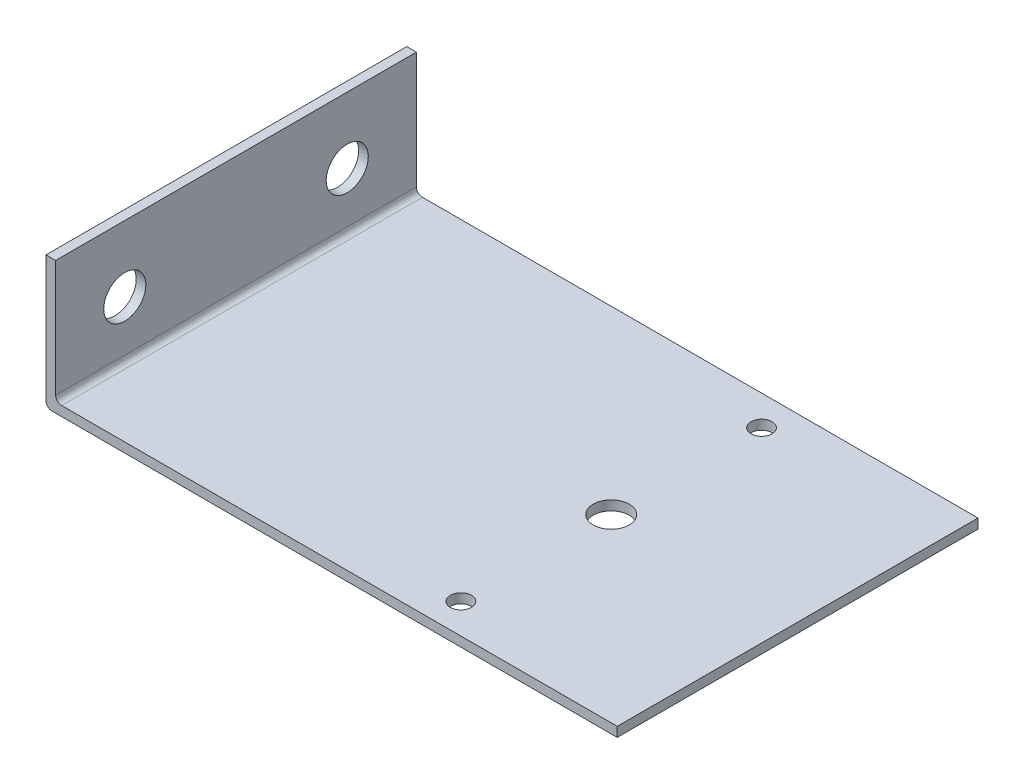
ISO-10303-21;
HEADER;
FILE_DESCRIPTION(('STEP AP214'),'2;1');
FILE_NAME('part.step','',(''),(''),'','','');
FILE_SCHEMA(('AUTOMOTIVE_DESIGN { 1 0 10303 214 1 1 1 1 }'));
ENDSEC;
DATA;
#1=APPLICATION_CONTEXT('core data for automotive mechanical design processes');
#2=APPLICATION_PROTOCOL_DEFINITION('international standard','automotive_design',2000,#1);
#3=PRODUCT_CONTEXT('',#1,'mechanical');
#4=PRODUCT('Part','Part','',(#3));
#5=PRODUCT_RELATED_PRODUCT_CATEGORY('part','',(#4));
#6=PRODUCT_DEFINITION_FORMATION('','',#4);
#7=PRODUCT_DEFINITION_CONTEXT('part definition',#1,'design');
#8=PRODUCT_DEFINITION('design','',#6,#7);
#9=PRODUCT_DEFINITION_SHAPE('','',#8);
#10=(LENGTH_UNIT() NAMED_UNIT(*) SI_UNIT(.MILLI.,.METRE.));
#11=(NAMED_UNIT(*) PLANE_ANGLE_UNIT() SI_UNIT($,.RADIAN.));
#12=(NAMED_UNIT(*) SI_UNIT($,.STERADIAN.) SOLID_ANGLE_UNIT());
#13=UNCERTAINTY_MEASURE_WITH_UNIT(LENGTH_MEASURE(1.E-05),#10,'distance_accuracy_value','');
#14=(GEOMETRIC_REPRESENTATION_CONTEXT(3) GLOBAL_UNCERTAINTY_ASSIGNED_CONTEXT((#13)) GLOBAL_UNIT_ASSIGNED_CONTEXT((#10,
#11,#12)) REPRESENTATION_CONTEXT('',''));
#15=CARTESIAN_POINT('',(0.,0.,0.));
#16=DIRECTION('',(0.,0.,1.));
#17=DIRECTION('',(1.,0.,0.));
#18=AXIS2_PLACEMENT_3D('',#15,#16,#17);
#19=CARTESIAN_POINT('',(-93.4,22.,60.));
#20=DIRECTION('',(0.,-1.,0.));
#21=DIRECTION('',(1.,0.,0.));
#22=AXIS2_PLACEMENT_3D('',#19,#20,#21);
#23=PLANE('',#22);
#24=DIRECTION('',(-1.,0.,0.));
#25=VECTOR('',#24,1.);
#26=CARTESIAN_POINT('',(-93.4,22.,0.));
#27=LINE('',#26,#25);
#28=CARTESIAN_POINT('',(-93.4,22.,0.));
#29=VERTEX_POINT('',#28);
#30=CARTESIAN_POINT('',(-95.,22.,0.));
#31=VERTEX_POINT('',#30);
#32=EDGE_CURVE('E124',#29,#31,#27,.T.);
#33=ORIENTED_EDGE('',*,*,#32,.T.);
#34=DIRECTION('',(0.,0.,-1.));
#35=VECTOR('',#34,1.);
#36=CARTESIAN_POINT('',(-95.,22.,60.));
#37=LINE('',#36,#35);
#38=CARTESIAN_POINT('',(-95.,22.,60.));
#39=VERTEX_POINT('',#38);
#40=EDGE_CURVE('E105',#39,#31,#37,.T.);
#41=ORIENTED_EDGE('',*,*,#40,.F.);
#42=DIRECTION('',(-1.,0.,0.));
#43=VECTOR('',#42,1.);
#44=CARTESIAN_POINT('',(-93.4,22.,60.));
#45=LINE('',#44,#43);
#46=CARTESIAN_POINT('',(-93.4,22.,60.));
#47=VERTEX_POINT('',#46);
#48=EDGE_CURVE('E112',#47,#39,#45,.T.);
#49=ORIENTED_EDGE('',*,*,#48,.F.);
#50=DIRECTION('',(0.,0.,-1.));
#51=VECTOR('',#50,1.);
#52=CARTESIAN_POINT('',(-93.4,22.,60.));
#53=LINE('',#52,#51);
#54=EDGE_CURVE('E181',#47,#29,#53,.T.);
#55=ORIENTED_EDGE('',*,*,#54,.T.);
#56=EDGE_LOOP('',(#33,#41,#49,#55));
#57=FACE_BOUND('',#56,.T.);
#58=ADVANCED_FACE('F33',(#57),#23,.F.);
#59=CARTESIAN_POINT('',(-95.,22.,60.));
#60=DIRECTION('',(1.,0.,0.));
#61=DIRECTION('',(0.,0.,-1.));
#62=AXIS2_PLACEMENT_3D('',#59,#60,#61);
#63=PLANE('',#62);
#64=CARTESIAN_POINT('',(-95.,11.,48.5));
#65=DIRECTION('',(-1.,0.,0.));
#66=DIRECTION('',(0.,0.,1.));
#67=AXIS2_PLACEMENT_3D('',#64,#65,#66);
#68=CIRCLE('',#67,3.5);
#69=CARTESIAN_POINT('',(-95.,11.,52.));
#70=VERTEX_POINT('',#69);
#71=EDGE_CURVE('E158',#70,#70,#68,.T.);
#72=ORIENTED_EDGE('',*,*,#71,.F.);
#73=EDGE_LOOP('',(#72));
#74=FACE_BOUND('',#73,.T.);
#75=CARTESIAN_POINT('',(-95.,11.,11.5));
#76=DIRECTION('',(-1.,0.,0.));
#77=DIRECTION('',(0.,0.,1.));
#78=AXIS2_PLACEMENT_3D('',#75,#76,#77);
#79=CIRCLE('',#78,3.5);
#80=CARTESIAN_POINT('',(-95.,11.,15.));
#81=VERTEX_POINT('',#80);
#82=EDGE_CURVE('E147',#81,#81,#79,.T.);
#83=ORIENTED_EDGE('',*,*,#82,.F.);
#84=EDGE_LOOP('',(#83));
#85=FACE_BOUND('',#84,.T.);
#86=DIRECTION('',(0.,-1.,0.));
#87=VECTOR('',#86,1.);
#88=CARTESIAN_POINT('',(-95.,22.,0.));
#89=LINE('',#88,#87);
#90=CARTESIAN_POINT('',(-95.,1.,0.));
#91=VERTEX_POINT('',#90);
#92=EDGE_CURVE('E183',#31,#91,#89,.T.);
#93=ORIENTED_EDGE('',*,*,#92,.T.);
#94=DIRECTION('',(0.,0.,-1.));
#95=VECTOR('',#94,1.);
#96=CARTESIAN_POINT('',(-95.,1.,60.));
#97=LINE('',#96,#95);
#98=CARTESIAN_POINT('',(-95.,1.,60.));
#99=VERTEX_POINT('',#98);
#100=EDGE_CURVE('E108',#91,#99,#97,.F.);
#101=ORIENTED_EDGE('',*,*,#100,.T.);
#102=DIRECTION('',(0.,-1.,0.));
#103=VECTOR('',#102,1.);
#104=CARTESIAN_POINT('',(-95.,22.,60.));
#105=LINE('',#104,#103);
#106=EDGE_CURVE('E100',#39,#99,#105,.T.);
#107=ORIENTED_EDGE('',*,*,#106,.F.);
#108=ORIENTED_EDGE('',*,*,#40,.T.);
#109=EDGE_LOOP('',(#93,#101,#107,#108));
#110=FACE_BOUND('',#109,.T.);
#111=ADVANCED_FACE('F103',(#74,#85,#110),#63,.F.);
#112=CARTESIAN_POINT('',(-95.,0.,60.));
#113=DIRECTION('',(0.,1.,0.));
#114=DIRECTION('',(0.,0.,1.));
#115=AXIS2_PLACEMENT_3D('',#112,#113,#114);
#116=PLANE('',#115);
#117=CARTESIAN_POINT('',(-31.,0.,55.));
#118=DIRECTION('',(0.,1.,0.));
#119=DIRECTION('',(0.,0.,1.));
#120=AXIS2_PLACEMENT_3D('',#117,#118,#119);
#121=CIRCLE('',#120,1.75);
#122=CARTESIAN_POINT('',(-31.,0.,56.75));
#123=VERTEX_POINT('',#122);
#124=EDGE_CURVE('E151',#123,#123,#121,.F.);
#125=ORIENTED_EDGE('',*,*,#124,.F.);
#126=EDGE_LOOP('',(#125));
#127=FACE_BOUND('',#126,.T.);
#128=CARTESIAN_POINT('',(-31.,0.,30.));
#129=DIRECTION('',(0.,1.,0.));
#130=DIRECTION('',(0.,0.,1.));
#131=AXIS2_PLACEMENT_3D('',#128,#129,#130);
#132=CIRCLE('',#131,3.);
#133=CARTESIAN_POINT('',(-31.,0.,33.));
#134=VERTEX_POINT('',#133);
#135=EDGE_CURVE('E166',#134,#134,#132,.F.);
#136=ORIENTED_EDGE('',*,*,#135,.F.);
#137=EDGE_LOOP('',(#136));
#138=FACE_BOUND('',#137,.T.);
#139=CARTESIAN_POINT('',(-31.,0.,5.));
#140=DIRECTION('',(0.,1.,0.));
#141=DIRECTION('',(0.,0.,1.));
#142=AXIS2_PLACEMENT_3D('',#139,#140,#141);
#143=CIRCLE('',#142,1.75);
#144=CARTESIAN_POINT('',(-31.,0.,6.75));
#145=VERTEX_POINT('',#144);
#146=EDGE_CURVE('E172',#145,#145,#143,.F.);
#147=ORIENTED_EDGE('',*,*,#146,.F.);
#148=EDGE_LOOP('',(#147));
#149=FACE_BOUND('',#148,.T.);
#150=DIRECTION('',(1.,0.,0.));
#151=VECTOR('',#150,1.);
#152=CARTESIAN_POINT('',(-95.,0.,60.));
#153=LINE('',#152,#151);
#154=CARTESIAN_POINT('',(-94.,0.,60.));
#155=VERTEX_POINT('',#154);
#156=CARTESIAN_POINT('',(0.,0.,60.));
#157=VERTEX_POINT('',#156);
#158=EDGE_CURVE('E111',#155,#157,#153,.T.);
#159=ORIENTED_EDGE('',*,*,#158,.F.);
#160=DIRECTION('',(0.,0.,-1.));
#161=VECTOR('',#160,1.);
#162=CARTESIAN_POINT('',(-94.,0.,60.));
#163=LINE('',#162,#161);
#164=CARTESIAN_POINT('',(-94.,0.,0.));
#165=VERTEX_POINT('',#164);
#166=EDGE_CURVE('E125',#155,#165,#163,.T.);
#167=ORIENTED_EDGE('',*,*,#166,.T.);
#168=DIRECTION('',(1.,0.,0.));
#169=VECTOR('',#168,1.);
#170=CARTESIAN_POINT('',(-95.,0.,0.));
#171=LINE('',#170,#169);
#172=CARTESIAN_POINT('',(0.,0.,0.));
#173=VERTEX_POINT('',#172);
#174=EDGE_CURVE('E185',#165,#173,#171,.T.);
#175=ORIENTED_EDGE('',*,*,#174,.T.);
#176=DIRECTION('',(0.,0.,-1.));
#177=VECTOR('',#176,1.);
#178=CARTESIAN_POINT('',(0.,0.,60.));
#179=LINE('',#178,#177);
#180=EDGE_CURVE('E126',#157,#173,#179,.T.);
#181=ORIENTED_EDGE('',*,*,#180,.F.);
#182=EDGE_LOOP('',(#159,#167,#175,#181));
#183=FACE_BOUND('',#182,.T.);
#184=ADVANCED_FACE('F204',(#127,#138,#149,#183),#116,.F.);
#185=CARTESIAN_POINT('',(0.,0.,60.));
#186=DIRECTION('',(-1.,0.,0.));
#187=DIRECTION('',(0.,0.,1.));
#188=AXIS2_PLACEMENT_3D('',#185,#186,#187);
#189=PLANE('',#188);
#190=DIRECTION('',(0.,1.,0.));
#191=VECTOR('',#190,1.);
#192=CARTESIAN_POINT('',(0.,0.,0.));
#193=LINE('',#192,#191);
#194=CARTESIAN_POINT('',(0.,1.6,0.));
#195=VERTEX_POINT('',#194);
#196=EDGE_CURVE('E187',#173,#195,#193,.T.);
#197=ORIENTED_EDGE('',*,*,#196,.T.);
#198=DIRECTION('',(0.,0.,-1.));
#199=VECTOR('',#198,1.);
#200=CARTESIAN_POINT('',(0.,1.6,60.));
#201=LINE('',#200,#199);
#202=CARTESIAN_POINT('',(0.,1.6,60.));
#203=VERTEX_POINT('',#202);
#204=EDGE_CURVE('E132',#203,#195,#201,.T.);
#205=ORIENTED_EDGE('',*,*,#204,.F.);
#206=DIRECTION('',(0.,1.,0.));
#207=VECTOR('',#206,1.);
#208=CARTESIAN_POINT('',(0.,0.,60.));
#209=LINE('',#208,#207);
#210=EDGE_CURVE('E176',#157,#203,#209,.T.);
#211=ORIENTED_EDGE('',*,*,#210,.F.);
#212=ORIENTED_EDGE('',*,*,#180,.T.);
#213=EDGE_LOOP('',(#197,#205,#211,#212));
#214=FACE_BOUND('',#213,.T.);
#215=ADVANCED_FACE('F200',(#214),#189,.F.);
#216=CARTESIAN_POINT('',(0.,1.6,60.));
#217=DIRECTION('',(0.,-1.,0.));
#218=DIRECTION('',(1.,0.,0.));
#219=AXIS2_PLACEMENT_3D('',#216,#217,#218);
#220=PLANE('',#219);
#221=CARTESIAN_POINT('',(-31.,1.6,55.));
#222=DIRECTION('',(0.,1.,0.));
#223=DIRECTION('',(-1.,0.,0.));
#224=AXIS2_PLACEMENT_3D('',#221,#222,#223);
#225=CIRCLE('',#224,1.75);
#226=CARTESIAN_POINT('',(-32.75,1.6,55.));
#227=VERTEX_POINT('',#226);
#228=EDGE_CURVE('E146',#227,#227,#225,.T.);
#229=ORIENTED_EDGE('',*,*,#228,.F.);
#230=EDGE_LOOP('',(#229));
#231=FACE_BOUND('',#230,.T.);
#232=CARTESIAN_POINT('',(-31.,1.6,30.));
#233=DIRECTION('',(0.,1.,0.));
#234=DIRECTION('',(-1.,0.,0.));
#235=AXIS2_PLACEMENT_3D('',#232,#233,#234);
#236=CIRCLE('',#235,3.);
#237=CARTESIAN_POINT('',(-34.,1.6,30.));
#238=VERTEX_POINT('',#237);
#239=EDGE_CURVE('E163',#238,#238,#236,.T.);
#240=ORIENTED_EDGE('',*,*,#239,.F.);
#241=EDGE_LOOP('',(#240));
#242=FACE_BOUND('',#241,.T.);
#243=CARTESIAN_POINT('',(-31.,1.6,5.));
#244=DIRECTION('',(0.,1.,0.));
#245=DIRECTION('',(-1.,0.,0.));
#246=AXIS2_PLACEMENT_3D('',#243,#244,#245);
#247=CIRCLE('',#246,1.75);
#248=CARTESIAN_POINT('',(-32.75,1.6,5.));
#249=VERTEX_POINT('',#248);
#250=EDGE_CURVE('E169',#249,#249,#247,.T.);
#251=ORIENTED_EDGE('',*,*,#250,.F.);
#252=EDGE_LOOP('',(#251));
#253=FACE_BOUND('',#252,.T.);
#254=DIRECTION('',(-1.,0.,0.));
#255=VECTOR('',#254,1.);
#256=CARTESIAN_POINT('',(0.,1.6,0.));
#257=LINE('',#256,#255);
#258=CARTESIAN_POINT('',(-92.4,1.59999999999999,0.));
#259=VERTEX_POINT('',#258);
#260=EDGE_CURVE('E189',#195,#259,#257,.T.);
#261=ORIENTED_EDGE('',*,*,#260,.T.);
#262=DIRECTION('',(0.,0.,-1.));
#263=VECTOR('',#262,1.);
#264=CARTESIAN_POINT('',(-92.4,1.59999999999999,60.));
#265=LINE('',#264,#263);
#266=CARTESIAN_POINT('',(-92.4,1.59999999999999,60.));
#267=VERTEX_POINT('',#266);
#268=EDGE_CURVE('E50',#259,#267,#265,.F.);
#269=ORIENTED_EDGE('',*,*,#268,.T.);
#270=DIRECTION('',(-1.,0.,0.));
#271=VECTOR('',#270,1.);
#272=CARTESIAN_POINT('',(0.,1.6,60.));
#273=LINE('',#272,#271);
#274=EDGE_CURVE('E178',#203,#267,#273,.T.);
#275=ORIENTED_EDGE('',*,*,#274,.F.);
#276=ORIENTED_EDGE('',*,*,#204,.T.);
#277=EDGE_LOOP('',(#261,#269,#275,#276));
#278=FACE_BOUND('',#277,.T.);
#279=ADVANCED_FACE('F194',(#231,#242,#253,#278),#220,.F.);
#280=CARTESIAN_POINT('',(-93.4,1.59999999999999,60.));
#281=DIRECTION('',(-1.,0.,0.));
#282=DIRECTION('',(0.,-1.,0.));
#283=AXIS2_PLACEMENT_3D('',#280,#281,#282);
#284=PLANE('',#283);
#285=CARTESIAN_POINT('',(-93.4,11.,48.5));
#286=DIRECTION('',(-1.,0.,0.));
#287=DIRECTION('',(0.,-1.,0.));
#288=AXIS2_PLACEMENT_3D('',#285,#286,#287);
#289=CIRCLE('',#288,3.5);
#290=CARTESIAN_POINT('',(-93.4,7.5,48.5));
#291=VERTEX_POINT('',#290);
#292=EDGE_CURVE('E37',#291,#291,#289,.T.);
#293=ORIENTED_EDGE('',*,*,#292,.T.);
#294=EDGE_LOOP('',(#293));
#295=FACE_BOUND('',#294,.T.);
#296=CARTESIAN_POINT('',(-93.4,11.,11.5));
#297=DIRECTION('',(-1.,0.,0.));
#298=DIRECTION('',(0.,-1.,0.));
#299=AXIS2_PLACEMENT_3D('',#296,#297,#298);
#300=CIRCLE('',#299,3.5);
#301=CARTESIAN_POINT('',(-93.4,7.5,11.5));
#302=VERTEX_POINT('',#301);
#303=EDGE_CURVE('E144',#302,#302,#300,.T.);
#304=ORIENTED_EDGE('',*,*,#303,.T.);
#305=EDGE_LOOP('',(#304));
#306=FACE_BOUND('',#305,.T.);
#307=DIRECTION('',(0.,1.,0.));
#308=VECTOR('',#307,1.);
#309=CARTESIAN_POINT('',(-93.4,1.59999999999999,60.));
#310=LINE('',#309,#308);
#311=CARTESIAN_POINT('',(-93.4,2.59999999999999,60.));
#312=VERTEX_POINT('',#311);
#313=EDGE_CURVE('E117',#312,#47,#310,.T.);
#314=ORIENTED_EDGE('',*,*,#313,.F.);
#315=DIRECTION('',(0.,0.,-1.));
#316=VECTOR('',#315,1.);
#317=CARTESIAN_POINT('',(-93.4,2.59999999999999,0.));
#318=LINE('',#317,#316);
#319=CARTESIAN_POINT('',(-93.4,2.59999999999999,0.));
#320=VERTEX_POINT('',#319);
#321=EDGE_CURVE('E140',#312,#320,#318,.T.);
#322=ORIENTED_EDGE('',*,*,#321,.T.);
#323=DIRECTION('',(0.,1.,0.));
#324=VECTOR('',#323,1.);
#325=CARTESIAN_POINT('',(-93.4,1.59999999999999,0.));
#326=LINE('',#325,#324);
#327=EDGE_CURVE('E121',#320,#29,#326,.T.);
#328=ORIENTED_EDGE('',*,*,#327,.T.);
#329=ORIENTED_EDGE('',*,*,#54,.F.);
#330=EDGE_LOOP('',(#314,#322,#328,#329));
#331=FACE_BOUND('',#330,.T.);
#332=ADVANCED_FACE('F209',(#295,#306,#331),#284,.F.);
#333=CARTESIAN_POINT('',(0.,0.,60.));
#334=DIRECTION('',(0.,0.,1.));
#335=DIRECTION('',(1.,0.,0.));
#336=AXIS2_PLACEMENT_3D('',#333,#334,#335);
#337=PLANE('',#336);
#338=ORIENTED_EDGE('',*,*,#106,.T.);
#339=CARTESIAN_POINT('',(-94.,1.,60.));
#340=DIRECTION('',(0.,0.,1.));
#341=DIRECTION('',(1.,0.,0.));
#342=AXIS2_PLACEMENT_3D('',#339,#340,#341);
#343=CIRCLE('',#342,1.);
#344=EDGE_CURVE('E138',#99,#155,#343,.T.);
#345=ORIENTED_EDGE('',*,*,#344,.T.);
#346=ORIENTED_EDGE('',*,*,#158,.T.);
#347=ORIENTED_EDGE('',*,*,#210,.T.);
#348=ORIENTED_EDGE('',*,*,#274,.T.);
#349=CARTESIAN_POINT('',(-92.4,2.59999999999999,60.));
#350=DIRECTION('',(0.,0.,1.));
#351=DIRECTION('',(1.,0.,0.));
#352=AXIS2_PLACEMENT_3D('',#349,#350,#351);
#353=CIRCLE('',#352,1.);
#354=EDGE_CURVE('E11',#267,#312,#353,.F.);
#355=ORIENTED_EDGE('',*,*,#354,.T.);
#356=ORIENTED_EDGE('',*,*,#313,.T.);
#357=ORIENTED_EDGE('',*,*,#48,.T.);
#358=EDGE_LOOP('',(#338,#345,#346,#347,#348,#355,#356,#357));
#359=FACE_BOUND('',#358,.T.);
#360=ADVANCED_FACE('F115',(#359),#337,.T.);
#361=CARTESIAN_POINT('',(0.,0.,0.));
#362=DIRECTION('',(0.,0.,1.));
#363=DIRECTION('',(1.,0.,0.));
#364=AXIS2_PLACEMENT_3D('',#361,#362,#363);
#365=PLANE('',#364);
#366=ORIENTED_EDGE('',*,*,#174,.F.);
#367=CARTESIAN_POINT('',(-94.,1.,0.));
#368=DIRECTION('',(0.,0.,1.));
#369=DIRECTION('',(1.,0.,0.));
#370=AXIS2_PLACEMENT_3D('',#367,#368,#369);
#371=CIRCLE('',#370,1.);
#372=EDGE_CURVE('E129',#165,#91,#371,.F.);
#373=ORIENTED_EDGE('',*,*,#372,.T.);
#374=ORIENTED_EDGE('',*,*,#92,.F.);
#375=ORIENTED_EDGE('',*,*,#32,.F.);
#376=ORIENTED_EDGE('',*,*,#327,.F.);
#377=CARTESIAN_POINT('',(-92.4,2.59999999999999,0.));
#378=DIRECTION('',(0.,0.,1.));
#379=DIRECTION('',(1.,0.,0.));
#380=AXIS2_PLACEMENT_3D('',#377,#378,#379);
#381=CIRCLE('',#380,1.);
#382=EDGE_CURVE('E42',#320,#259,#381,.T.);
#383=ORIENTED_EDGE('',*,*,#382,.T.);
#384=ORIENTED_EDGE('',*,*,#260,.F.);
#385=ORIENTED_EDGE('',*,*,#196,.F.);
#386=EDGE_LOOP('',(#366,#373,#374,#375,#376,#383,#384,#385));
#387=FACE_BOUND('',#386,.T.);
#388=ADVANCED_FACE('F199',(#387),#365,.F.);
#389=CARTESIAN_POINT('',(-94.,1.,60.));
#390=DIRECTION('',(0.,0.,-1.));
#391=DIRECTION('',(-1.,0.,0.));
#392=AXIS2_PLACEMENT_3D('',#389,#390,#391);
#393=CYLINDRICAL_SURFACE('',#392,1.);
#394=ORIENTED_EDGE('',*,*,#344,.F.);
#395=ORIENTED_EDGE('',*,*,#100,.F.);
#396=ORIENTED_EDGE('',*,*,#372,.F.);
#397=ORIENTED_EDGE('',*,*,#166,.F.);
#398=EDGE_LOOP('',(#394,#395,#396,#397));
#399=FACE_BOUND('',#398,.T.);
#400=ADVANCED_FACE('F207',(#399),#393,.T.);
#401=CARTESIAN_POINT('',(-92.4,2.59999999999999,60.));
#402=DIRECTION('',(0.,0.,1.));
#403=DIRECTION('',(1.,0.,0.));
#404=AXIS2_PLACEMENT_3D('',#401,#402,#403);
#405=CYLINDRICAL_SURFACE('',#404,1.);
#406=ORIENTED_EDGE('',*,*,#354,.F.);
#407=ORIENTED_EDGE('',*,*,#268,.F.);
#408=ORIENTED_EDGE('',*,*,#382,.F.);
#409=ORIENTED_EDGE('',*,*,#321,.F.);
#410=EDGE_LOOP('',(#406,#407,#408,#409));
#411=FACE_BOUND('',#410,.T.);
#412=ADVANCED_FACE('F35',(#411),#405,.F.);
#413=CARTESIAN_POINT('',(-31.,-0.0010000000000036,5.));
#414=DIRECTION('',(0.,1.,0.));
#415=DIRECTION('',(-1.,0.,0.));
#416=AXIS2_PLACEMENT_3D('',#413,#414,#415);
#417=CYLINDRICAL_SURFACE('',#416,1.75);
#418=ORIENTED_EDGE('',*,*,#250,.T.);
#419=EDGE_LOOP('',(#418));
#420=FACE_BOUND('',#419,.T.);
#421=ORIENTED_EDGE('',*,*,#146,.T.);
#422=EDGE_LOOP('',(#421));
#423=FACE_BOUND('',#422,.T.);
#424=ADVANCED_FACE('F214',(#420,#423),#417,.F.);
#425=CARTESIAN_POINT('',(-31.,-0.0010000000000036,30.));
#426=DIRECTION('',(0.,1.,0.));
#427=DIRECTION('',(-1.,0.,0.));
#428=AXIS2_PLACEMENT_3D('',#425,#426,#427);
#429=CYLINDRICAL_SURFACE('',#428,3.);
#430=ORIENTED_EDGE('',*,*,#239,.T.);
#431=EDGE_LOOP('',(#430));
#432=FACE_BOUND('',#431,.T.);
#433=ORIENTED_EDGE('',*,*,#135,.T.);
#434=EDGE_LOOP('',(#433));
#435=FACE_BOUND('',#434,.T.);
#436=ADVANCED_FACE('F219',(#432,#435),#429,.F.);
#437=CARTESIAN_POINT('',(-31.,-0.0010000000000036,55.));
#438=DIRECTION('',(0.,1.,0.));
#439=DIRECTION('',(-1.,0.,0.));
#440=AXIS2_PLACEMENT_3D('',#437,#438,#439);
#441=CYLINDRICAL_SURFACE('',#440,1.75);
#442=ORIENTED_EDGE('',*,*,#228,.T.);
#443=EDGE_LOOP('',(#442));
#444=FACE_BOUND('',#443,.T.);
#445=ORIENTED_EDGE('',*,*,#124,.T.);
#446=EDGE_LOOP('',(#445));
#447=FACE_BOUND('',#446,.T.);
#448=ADVANCED_FACE('F248',(#444,#447),#441,.F.);
#449=CARTESIAN_POINT('',(0.,11.,11.5));
#450=DIRECTION('',(-1.,0.,0.));
#451=DIRECTION('',(0.,0.,1.));
#452=AXIS2_PLACEMENT_3D('',#449,#450,#451);
#453=CYLINDRICAL_SURFACE('',#452,3.5);
#454=ORIENTED_EDGE('',*,*,#82,.T.);
#455=EDGE_LOOP('',(#454));
#456=FACE_BOUND('',#455,.T.);
#457=ORIENTED_EDGE('',*,*,#303,.F.);
#458=EDGE_LOOP('',(#457));
#459=FACE_BOUND('',#458,.T.);
#460=ADVANCED_FACE('F252',(#456,#459),#453,.F.);
#461=CARTESIAN_POINT('',(0.,11.,48.5));
#462=DIRECTION('',(-1.,0.,0.));
#463=DIRECTION('',(0.,0.,1.));
#464=AXIS2_PLACEMENT_3D('',#461,#462,#463);
#465=CYLINDRICAL_SURFACE('',#464,3.5);
#466=ORIENTED_EDGE('',*,*,#71,.T.);
#467=EDGE_LOOP('',(#466));
#468=FACE_BOUND('',#467,.T.);
#469=ORIENTED_EDGE('',*,*,#292,.F.);
#470=EDGE_LOOP('',(#469));
#471=FACE_BOUND('',#470,.T.);
#472=ADVANCED_FACE('F256',(#468,#471),#465,.F.);
#473=CLOSED_SHELL('',(#58,#111,#184,#215,#279,#332,#360,#388,#400,#412,#424,#436,#448,#460,#472));
#474=MANIFOLD_SOLID_BREP('B2',#473);
#475=ADVANCED_BREP_SHAPE_REPRESENTATION('',(#18,#474),#14);
#476=SHAPE_DEFINITION_REPRESENTATION(#9,#475);
ENDSEC;
END-ISO-10303-21;
